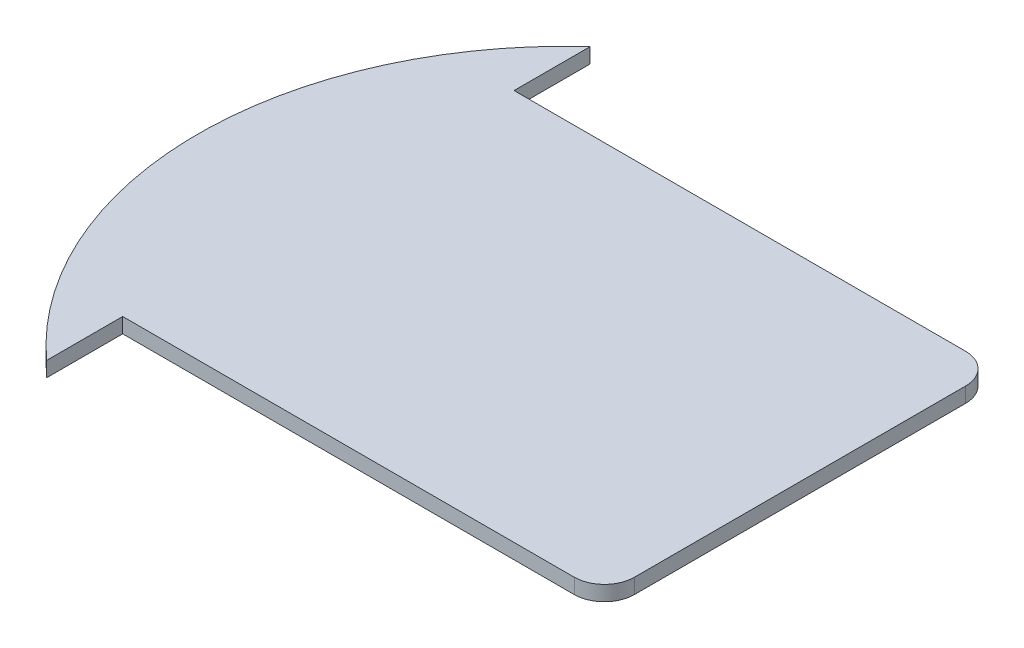
ISO-10303-21;
HEADER;
FILE_DESCRIPTION(('STEP AP214'),'2;1');
FILE_NAME('part.step','',(''),(''),'','','');
FILE_SCHEMA(('AUTOMOTIVE_DESIGN { 1 0 10303 214 1 1 1 1 }'));
ENDSEC;
DATA;
#1=APPLICATION_CONTEXT('core data for automotive mechanical design processes');
#2=APPLICATION_PROTOCOL_DEFINITION('international standard','automotive_design',2000,#1);
#3=PRODUCT_CONTEXT('',#1,'mechanical');
#4=PRODUCT('Part','Part','',(#3));
#5=PRODUCT_RELATED_PRODUCT_CATEGORY('part','',(#4));
#6=PRODUCT_DEFINITION_FORMATION('','',#4);
#7=PRODUCT_DEFINITION_CONTEXT('part definition',#1,'design');
#8=PRODUCT_DEFINITION('design','',#6,#7);
#9=PRODUCT_DEFINITION_SHAPE('','',#8);
#10=(LENGTH_UNIT() NAMED_UNIT(*) SI_UNIT(.MILLI.,.METRE.));
#11=(NAMED_UNIT(*) PLANE_ANGLE_UNIT() SI_UNIT($,.RADIAN.));
#12=(NAMED_UNIT(*) SI_UNIT($,.STERADIAN.) SOLID_ANGLE_UNIT());
#13=UNCERTAINTY_MEASURE_WITH_UNIT(LENGTH_MEASURE(1.E-05),#10,'distance_accuracy_value','');
#14=(GEOMETRIC_REPRESENTATION_CONTEXT(3) GLOBAL_UNCERTAINTY_ASSIGNED_CONTEXT((#13)) GLOBAL_UNIT_ASSIGNED_CONTEXT((#10,
#11,#12)) REPRESENTATION_CONTEXT('',''));
#15=CARTESIAN_POINT('',(0.,0.,0.));
#16=DIRECTION('',(0.,0.,1.));
#17=DIRECTION('',(1.,0.,0.));
#18=AXIS2_PLACEMENT_3D('',#15,#16,#17);
#19=CARTESIAN_POINT('',(200.301843205436,5.,-25.));
#20=DIRECTION('',(-1.,0.,0.));
#21=DIRECTION('',(0.,0.,1.));
#22=AXIS2_PLACEMENT_3D('',#19,#20,#21);
#23=PLANE('',#22);
#24=DIRECTION('',(0.,0.,-1.));
#25=VECTOR('',#24,1.);
#26=CARTESIAN_POINT('',(200.301843205436,0.,-25.));
#27=LINE('',#26,#25);
#28=CARTESIAN_POINT('',(200.301843205436,0.,-35.));
#29=VERTEX_POINT('',#28);
#30=CARTESIAN_POINT('',(200.301843205436,0.,-145.));
#31=VERTEX_POINT('',#30);
#32=EDGE_CURVE('E136',#29,#31,#27,.T.);
#33=ORIENTED_EDGE('',*,*,#32,.T.);
#34=DIRECTION('',(0.,-1.,0.));
#35=VECTOR('',#34,1.);
#36=CARTESIAN_POINT('',(200.301843205436,5.,-145.));
#37=LINE('',#36,#35);
#38=CARTESIAN_POINT('',(200.301843205436,5.,-145.));
#39=VERTEX_POINT('',#38);
#40=EDGE_CURVE('E58',#31,#39,#37,.F.);
#41=ORIENTED_EDGE('',*,*,#40,.T.);
#42=DIRECTION('',(0.,0.,-1.));
#43=VECTOR('',#42,1.);
#44=CARTESIAN_POINT('',(200.301843205436,5.,-25.));
#45=LINE('',#44,#43);
#46=CARTESIAN_POINT('',(200.301843205436,5.,-35.));
#47=VERTEX_POINT('',#46);
#48=EDGE_CURVE('E112',#47,#39,#45,.T.);
#49=ORIENTED_EDGE('',*,*,#48,.F.);
#50=DIRECTION('',(0.,-1.,0.));
#51=VECTOR('',#50,1.);
#52=CARTESIAN_POINT('',(200.301843205436,5.,-35.));
#53=LINE('',#52,#51);
#54=EDGE_CURVE('E159',#47,#29,#53,.T.);
#55=ORIENTED_EDGE('',*,*,#54,.T.);
#56=EDGE_LOOP('',(#33,#41,#49,#55));
#57=FACE_BOUND('',#56,.T.);
#58=ADVANCED_FACE('F37',(#57),#23,.F.);
#59=CARTESIAN_POINT('',(40.3018432054357,5.,-155.));
#60=DIRECTION('',(0.,0.,1.));
#61=DIRECTION('',(1.,0.,0.));
#62=AXIS2_PLACEMENT_3D('',#59,#60,#61);
#63=PLANE('',#62);
#64=DIRECTION('',(-1.,0.,0.));
#65=VECTOR('',#64,1.);
#66=CARTESIAN_POINT('',(110.301843205436,5.,-155.));
#67=LINE('',#66,#65);
#68=CARTESIAN_POINT('',(190.301843205436,5.,-155.));
#69=VERTEX_POINT('',#68);
#70=CARTESIAN_POINT('',(40.3018432054357,5.,-155.));
#71=VERTEX_POINT('',#70);
#72=EDGE_CURVE('E102',#69,#71,#67,.T.);
#73=ORIENTED_EDGE('',*,*,#72,.F.);
#74=DIRECTION('',(0.,-1.,0.));
#75=VECTOR('',#74,1.);
#76=CARTESIAN_POINT('',(190.301843205436,5.,-155.));
#77=LINE('',#76,#75);
#78=CARTESIAN_POINT('',(190.301843205436,0.,-155.));
#79=VERTEX_POINT('',#78);
#80=EDGE_CURVE('E121',#69,#79,#77,.T.);
#81=ORIENTED_EDGE('',*,*,#80,.T.);
#82=DIRECTION('',(-1.,0.,0.));
#83=VECTOR('',#82,1.);
#84=CARTESIAN_POINT('',(40.3018432054357,0.,-155.));
#85=LINE('',#84,#83);
#86=CARTESIAN_POINT('',(40.3018432054357,0.,-155.));
#87=VERTEX_POINT('',#86);
#88=EDGE_CURVE('E118',#79,#87,#85,.T.);
#89=ORIENTED_EDGE('',*,*,#88,.T.);
#90=DIRECTION('',(0.,-1.,0.));
#91=VECTOR('',#90,1.);
#92=CARTESIAN_POINT('',(40.3018432054357,5.,-155.));
#93=LINE('',#92,#91);
#94=EDGE_CURVE('E115',#71,#87,#93,.T.);
#95=ORIENTED_EDGE('',*,*,#94,.F.);
#96=EDGE_LOOP('',(#73,#81,#89,#95));
#97=FACE_BOUND('',#96,.T.);
#98=ADVANCED_FACE('F116',(#97),#63,.F.);
#99=CARTESIAN_POINT('',(40.3018432054356,5.,-180.274660170197));
#100=DIRECTION('',(-1.,0.,0.));
#101=DIRECTION('',(0.,0.,1.));
#102=AXIS2_PLACEMENT_3D('',#99,#100,#101);
#103=PLANE('',#102);
#104=DIRECTION('',(0.,0.,-1.));
#105=VECTOR('',#104,1.);
#106=CARTESIAN_POINT('',(40.3018432054356,0.,-180.274660170197));
#107=LINE('',#106,#105);
#108=CARTESIAN_POINT('',(40.3018432054356,0.,-180.274660170197));
#109=VERTEX_POINT('',#108);
#110=EDGE_CURVE('E139',#87,#109,#107,.T.);
#111=ORIENTED_EDGE('',*,*,#110,.T.);
#112=DIRECTION('',(0.,-1.,0.));
#113=VECTOR('',#112,1.);
#114=CARTESIAN_POINT('',(40.3018432054356,5.,-180.274660170197));
#115=LINE('',#114,#113);
#116=CARTESIAN_POINT('',(40.3018432054356,5.,-180.274660170197));
#117=VERTEX_POINT('',#116);
#118=EDGE_CURVE('E122',#117,#109,#115,.T.);
#119=ORIENTED_EDGE('',*,*,#118,.F.);
#120=DIRECTION('',(0.,0.,-1.));
#121=VECTOR('',#120,1.);
#122=CARTESIAN_POINT('',(40.3018432054356,5.,-180.274660170197));
#123=LINE('',#122,#121);
#124=EDGE_CURVE('E106',#71,#117,#123,.T.);
#125=ORIENTED_EDGE('',*,*,#124,.F.);
#126=ORIENTED_EDGE('',*,*,#94,.T.);
#127=EDGE_LOOP('',(#111,#119,#125,#126));
#128=FACE_BOUND('',#127,.T.);
#129=ADVANCED_FACE('F124',(#128),#103,.F.);
#130=CARTESIAN_POINT('',(122.170771565992,5.,-90.));
#131=DIRECTION('',(0.,-1.,0.));
#132=DIRECTION('',(0.,0.,-1.));
#133=AXIS2_PLACEMENT_3D('',#130,#131,#132);
#134=CYLINDRICAL_SURFACE('',#133,121.868928360557);
#135=CARTESIAN_POINT('',(122.170771565992,0.,-90.));
#136=DIRECTION('',(0.,1.,0.));
#137=DIRECTION('',(0.,0.,1.));
#138=AXIS2_PLACEMENT_3D('',#135,#136,#137);
#139=CIRCLE('',#138,121.868928360557);
#140=CARTESIAN_POINT('',(40.3018432054356,0.,0.274660170196867));
#141=VERTEX_POINT('',#140);
#142=EDGE_CURVE('E141',#109,#141,#139,.T.);
#143=ORIENTED_EDGE('',*,*,#142,.T.);
#144=DIRECTION('',(0.,-1.,0.));
#145=VECTOR('',#144,1.);
#146=CARTESIAN_POINT('',(40.3018432054356,5.,0.274660170196867));
#147=LINE('',#146,#145);
#148=CARTESIAN_POINT('',(40.3018432054356,5.,0.274660170196867));
#149=VERTEX_POINT('',#148);
#150=EDGE_CURVE('E150',#149,#141,#147,.T.);
#151=ORIENTED_EDGE('',*,*,#150,.F.);
#152=CARTESIAN_POINT('',(122.170771565992,5.,-90.));
#153=DIRECTION('',(0.,1.,0.));
#154=DIRECTION('',(0.,0.,1.));
#155=AXIS2_PLACEMENT_3D('',#152,#153,#154);
#156=CIRCLE('',#155,121.868928360557);
#157=EDGE_CURVE('E127',#117,#149,#156,.T.);
#158=ORIENTED_EDGE('',*,*,#157,.F.);
#159=ORIENTED_EDGE('',*,*,#118,.T.);
#160=EDGE_LOOP('',(#143,#151,#158,#159));
#161=FACE_BOUND('',#160,.T.);
#162=ADVANCED_FACE('F180',(#161),#134,.T.);
#163=CARTESIAN_POINT('',(40.3018432054357,5.,-25.));
#164=DIRECTION('',(-1.,0.,0.));
#165=DIRECTION('',(0.,0.,1.));
#166=AXIS2_PLACEMENT_3D('',#163,#164,#165);
#167=PLANE('',#166);
#168=DIRECTION('',(0.,0.,-1.));
#169=VECTOR('',#168,1.);
#170=CARTESIAN_POINT('',(40.3018432054357,0.,-25.));
#171=LINE('',#170,#169);
#172=CARTESIAN_POINT('',(40.3018432054357,0.,-25.));
#173=VERTEX_POINT('',#172);
#174=EDGE_CURVE('E143',#141,#173,#171,.T.);
#175=ORIENTED_EDGE('',*,*,#174,.T.);
#176=DIRECTION('',(0.,-1.,0.));
#177=VECTOR('',#176,1.);
#178=CARTESIAN_POINT('',(40.3018432054357,5.,-25.));
#179=LINE('',#178,#177);
#180=CARTESIAN_POINT('',(40.3018432054357,5.,-25.));
#181=VERTEX_POINT('',#180);
#182=EDGE_CURVE('E135',#181,#173,#179,.T.);
#183=ORIENTED_EDGE('',*,*,#182,.F.);
#184=DIRECTION('',(0.,0.,-1.));
#185=VECTOR('',#184,1.);
#186=CARTESIAN_POINT('',(40.3018432054357,5.,-25.));
#187=LINE('',#186,#185);
#188=EDGE_CURVE('E129',#149,#181,#187,.T.);
#189=ORIENTED_EDGE('',*,*,#188,.F.);
#190=ORIENTED_EDGE('',*,*,#150,.T.);
#191=EDGE_LOOP('',(#175,#183,#189,#190));
#192=FACE_BOUND('',#191,.T.);
#193=ADVANCED_FACE('F176',(#192),#167,.F.);
#194=CARTESIAN_POINT('',(40.3018432054357,5.,-25.));
#195=DIRECTION('',(0.,0.,-1.));
#196=DIRECTION('',(-1.,0.,0.));
#197=AXIS2_PLACEMENT_3D('',#194,#195,#196);
#198=PLANE('',#197);
#199=DIRECTION('',(1.,0.,0.));
#200=VECTOR('',#199,1.);
#201=CARTESIAN_POINT('',(40.3018432054357,0.,-25.));
#202=LINE('',#201,#200);
#203=CARTESIAN_POINT('',(190.301843205436,0.,-25.));
#204=VERTEX_POINT('',#203);
#205=EDGE_CURVE('E145',#173,#204,#202,.T.);
#206=ORIENTED_EDGE('',*,*,#205,.T.);
#207=DIRECTION('',(0.,-1.,0.));
#208=VECTOR('',#207,1.);
#209=CARTESIAN_POINT('',(190.301843205436,5.,-25.));
#210=LINE('',#209,#208);
#211=CARTESIAN_POINT('',(190.301843205436,5.,-25.));
#212=VERTEX_POINT('',#211);
#213=EDGE_CURVE('E11',#204,#212,#210,.F.);
#214=ORIENTED_EDGE('',*,*,#213,.T.);
#215=DIRECTION('',(1.,0.,0.));
#216=VECTOR('',#215,1.);
#217=CARTESIAN_POINT('',(110.301843205436,5.,-25.));
#218=LINE('',#217,#216);
#219=EDGE_CURVE('E147',#181,#212,#218,.T.);
#220=ORIENTED_EDGE('',*,*,#219,.F.);
#221=ORIENTED_EDGE('',*,*,#182,.T.);
#222=EDGE_LOOP('',(#206,#214,#220,#221));
#223=FACE_BOUND('',#222,.T.);
#224=ADVANCED_FACE('F172',(#223),#198,.F.);
#225=CARTESIAN_POINT('',(122.170771565992,5.,-90.));
#226=DIRECTION('',(0.,1.,0.));
#227=DIRECTION('',(0.,0.,1.));
#228=AXIS2_PLACEMENT_3D('',#225,#226,#227);
#229=PLANE('',#228);
#230=ORIENTED_EDGE('',*,*,#48,.T.);
#231=CARTESIAN_POINT('',(190.301843205436,5.,-145.));
#232=DIRECTION('',(0.,1.,0.));
#233=DIRECTION('',(0.,0.,1.));
#234=AXIS2_PLACEMENT_3D('',#231,#232,#233);
#235=CIRCLE('',#234,10.);
#236=EDGE_CURVE('E45',#39,#69,#235,.T.);
#237=ORIENTED_EDGE('',*,*,#236,.T.);
#238=ORIENTED_EDGE('',*,*,#72,.T.);
#239=ORIENTED_EDGE('',*,*,#124,.T.);
#240=ORIENTED_EDGE('',*,*,#157,.T.);
#241=ORIENTED_EDGE('',*,*,#188,.T.);
#242=ORIENTED_EDGE('',*,*,#219,.T.);
#243=CARTESIAN_POINT('',(190.301843205436,5.,-35.));
#244=DIRECTION('',(0.,1.,0.));
#245=DIRECTION('',(0.,0.,1.));
#246=AXIS2_PLACEMENT_3D('',#243,#244,#245);
#247=CIRCLE('',#246,10.);
#248=EDGE_CURVE('E163',#212,#47,#247,.T.);
#249=ORIENTED_EDGE('',*,*,#248,.T.);
#250=EDGE_LOOP('',(#230,#237,#238,#239,#240,#241,#242,#249));
#251=FACE_BOUND('',#250,.T.);
#252=ADVANCED_FACE('F104',(#251),#229,.T.);
#253=CARTESIAN_POINT('',(122.170771565992,0.,-90.));
#254=DIRECTION('',(0.,1.,0.));
#255=DIRECTION('',(0.,0.,1.));
#256=AXIS2_PLACEMENT_3D('',#253,#254,#255);
#257=PLANE('',#256);
#258=ORIENTED_EDGE('',*,*,#88,.F.);
#259=CARTESIAN_POINT('',(190.301843205436,0.,-145.));
#260=DIRECTION('',(0.,1.,0.));
#261=DIRECTION('',(0.,0.,1.));
#262=AXIS2_PLACEMENT_3D('',#259,#260,#261);
#263=CIRCLE('',#262,10.);
#264=EDGE_CURVE('E157',#79,#31,#263,.F.);
#265=ORIENTED_EDGE('',*,*,#264,.T.);
#266=ORIENTED_EDGE('',*,*,#32,.F.);
#267=CARTESIAN_POINT('',(190.301843205436,0.,-35.));
#268=DIRECTION('',(0.,1.,0.));
#269=DIRECTION('',(0.,0.,1.));
#270=AXIS2_PLACEMENT_3D('',#267,#268,#269);
#271=CIRCLE('',#270,10.);
#272=EDGE_CURVE('E155',#29,#204,#271,.F.);
#273=ORIENTED_EDGE('',*,*,#272,.T.);
#274=ORIENTED_EDGE('',*,*,#205,.F.);
#275=ORIENTED_EDGE('',*,*,#174,.F.);
#276=ORIENTED_EDGE('',*,*,#142,.F.);
#277=ORIENTED_EDGE('',*,*,#110,.F.);
#278=EDGE_LOOP('',(#258,#265,#266,#273,#274,#275,#276,#277));
#279=FACE_BOUND('',#278,.T.);
#280=ADVANCED_FACE('F170',(#279),#257,.F.);
#281=CARTESIAN_POINT('',(190.301843205436,5.,-145.));
#282=DIRECTION('',(0.,-1.,0.));
#283=DIRECTION('',(0.,0.,-1.));
#284=AXIS2_PLACEMENT_3D('',#281,#282,#283);
#285=CYLINDRICAL_SURFACE('',#284,10.);
#286=ORIENTED_EDGE('',*,*,#236,.F.);
#287=ORIENTED_EDGE('',*,*,#40,.F.);
#288=ORIENTED_EDGE('',*,*,#264,.F.);
#289=ORIENTED_EDGE('',*,*,#80,.F.);
#290=EDGE_LOOP('',(#286,#287,#288,#289));
#291=FACE_BOUND('',#290,.T.);
#292=ADVANCED_FACE('F195',(#291),#285,.T.);
#293=CARTESIAN_POINT('',(190.301843205436,5.,-35.));
#294=DIRECTION('',(0.,-1.,0.));
#295=DIRECTION('',(0.,0.,-1.));
#296=AXIS2_PLACEMENT_3D('',#293,#294,#295);
#297=CYLINDRICAL_SURFACE('',#296,10.);
#298=ORIENTED_EDGE('',*,*,#248,.F.);
#299=ORIENTED_EDGE('',*,*,#213,.F.);
#300=ORIENTED_EDGE('',*,*,#272,.F.);
#301=ORIENTED_EDGE('',*,*,#54,.F.);
#302=EDGE_LOOP('',(#298,#299,#300,#301));
#303=FACE_BOUND('',#302,.T.);
#304=ADVANCED_FACE('F39',(#303),#297,.T.);
#305=CLOSED_SHELL('',(#58,#98,#129,#162,#193,#224,#252,#280,#292,#304));
#306=MANIFOLD_SOLID_BREP('B2',#305);
#307=ADVANCED_BREP_SHAPE_REPRESENTATION('',(#18,#306),#14);
#308=SHAPE_DEFINITION_REPRESENTATION(#9,#307);
ENDSEC;
END-ISO-10303-21;
